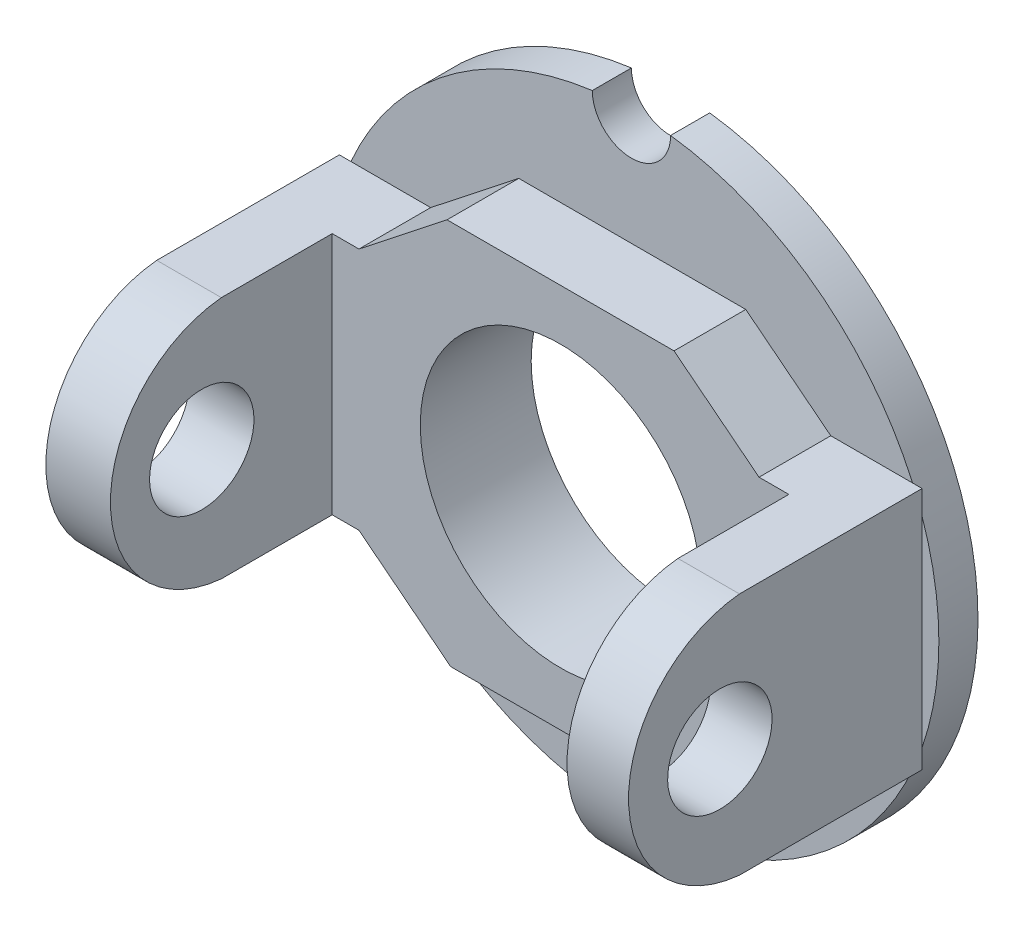
ISO-10303-21;
HEADER;
FILE_DESCRIPTION(('STEP AP214'),'2;1');
FILE_NAME('part.step','',(''),(''),'','','');
FILE_SCHEMA(('AUTOMOTIVE_DESIGN { 1 0 10303 214 1 1 1 1 }'));
ENDSEC;
DATA;
#1=APPLICATION_CONTEXT('core data for automotive mechanical design processes');
#2=APPLICATION_PROTOCOL_DEFINITION('international standard','automotive_design',2000,#1);
#3=PRODUCT_CONTEXT('',#1,'mechanical');
#4=PRODUCT('Part','Part','',(#3));
#5=PRODUCT_RELATED_PRODUCT_CATEGORY('part','',(#4));
#6=PRODUCT_DEFINITION_FORMATION('','',#4);
#7=PRODUCT_DEFINITION_CONTEXT('part definition',#1,'design');
#8=PRODUCT_DEFINITION('design','',#6,#7);
#9=PRODUCT_DEFINITION_SHAPE('','',#8);
#10=(LENGTH_UNIT() NAMED_UNIT(*) SI_UNIT(.MILLI.,.METRE.));
#11=(NAMED_UNIT(*) PLANE_ANGLE_UNIT() SI_UNIT($,.RADIAN.));
#12=(NAMED_UNIT(*) SI_UNIT($,.STERADIAN.) SOLID_ANGLE_UNIT());
#13=UNCERTAINTY_MEASURE_WITH_UNIT(LENGTH_MEASURE(1.E-05),#10,'distance_accuracy_value','');
#14=(GEOMETRIC_REPRESENTATION_CONTEXT(3) GLOBAL_UNCERTAINTY_ASSIGNED_CONTEXT((#13)) GLOBAL_UNIT_ASSIGNED_CONTEXT((#10,
#11,#12)) REPRESENTATION_CONTEXT('',''));
#15=CARTESIAN_POINT('',(0.,0.,0.));
#16=DIRECTION('',(0.,0.,1.));
#17=DIRECTION('',(1.,0.,0.));
#18=AXIS2_PLACEMENT_3D('',#15,#16,#17);
#19=CARTESIAN_POINT('',(22.2147106784625,0.,8.5));
#20=DIRECTION('',(1.,0.,0.));
#21=DIRECTION('',(0.,1.,0.));
#22=AXIS2_PLACEMENT_3D('',#19,#20,#21);
#23=PLANE('',#22);
#24=CARTESIAN_POINT('',(22.2147106784625,-0.0236961405543032,18.5031826355078));
#25=DIRECTION('',(1.,0.,0.));
#26=DIRECTION('',(0.,1.,0.));
#27=AXIS2_PLACEMENT_3D('',#24,#25,#26);
#28=CIRCLE('',#27,4.);
#29=CARTESIAN_POINT('',(22.2147106784625,3.9763038594457,18.5031826355078));
#30=VERTEX_POINT('',#29);
#31=EDGE_CURVE('E803',#30,#30,#28,.T.);
#32=ORIENTED_EDGE('',*,*,#31,.F.);
#33=EDGE_LOOP('',(#32));
#34=FACE_BOUND('',#33,.T.);
#35=CARTESIAN_POINT('',(22.2147106784625,0.187364912083141,16.1239867647059));
#36=DIRECTION('',(-1.,0.,0.));
#37=DIRECTION('',(0.,-1.,0.));
#38=AXIS2_PLACEMENT_3D('',#35,#36,#37);
#39=CIRCLE('',#38,9.37601323529412);
#40=CARTESIAN_POINT('',(22.2147106784625,-9.14763508791686,17.));
#41=VERTEX_POINT('',#40);
#42=CARTESIAN_POINT('',(22.2147106784625,9.52236491208314,17.));
#43=VERTEX_POINT('',#42);
#44=EDGE_CURVE('E186',#41,#43,#39,.T.);
#45=ORIENTED_EDGE('',*,*,#44,.F.);
#46=DIRECTION('',(0.,0.,-1.));
#47=VECTOR('',#46,1.);
#48=CARTESIAN_POINT('',(22.2147106784625,-9.14763508791686,8.5));
#49=LINE('',#48,#47);
#50=CARTESIAN_POINT('',(22.2147106784625,-9.14763508791686,3.));
#51=VERTEX_POINT('',#50);
#52=EDGE_CURVE('E208',#41,#51,#49,.T.);
#53=ORIENTED_EDGE('',*,*,#52,.T.);
#54=DIRECTION('',(0.,-1.,0.));
#55=VECTOR('',#54,1.);
#56=CARTESIAN_POINT('',(22.2147106784625,0.,3.));
#57=LINE('',#56,#55);
#58=CARTESIAN_POINT('',(22.2147106784625,-7.6652873052617,3.));
#59=VERTEX_POINT('',#58);
#60=EDGE_CURVE('E47',#59,#51,#57,.T.);
#61=ORIENTED_EDGE('',*,*,#60,.F.);
#62=CARTESIAN_POINT('',(22.2147106784625,7.66528730526171,3.));
#63=VERTEX_POINT('',#62);
#64=EDGE_CURVE('E11',#63,#59,#57,.T.);
#65=ORIENTED_EDGE('',*,*,#64,.F.);
#66=CARTESIAN_POINT('',(22.2147106784625,9.52236491208314,3.));
#67=VERTEX_POINT('',#66);
#68=EDGE_CURVE('E46',#67,#63,#57,.T.);
#69=ORIENTED_EDGE('',*,*,#68,.F.);
#70=DIRECTION('',(0.,0.,-1.));
#71=VECTOR('',#70,1.);
#72=CARTESIAN_POINT('',(22.2147106784625,9.52236491208314,8.5));
#73=LINE('',#72,#71);
#74=EDGE_CURVE('E200',#43,#67,#73,.T.);
#75=ORIENTED_EDGE('',*,*,#74,.F.);
#76=EDGE_LOOP('',(#45,#53,#61,#65,#69,#75));
#77=FACE_BOUND('',#76,.T.);
#78=ADVANCED_FACE('F35',(#34,#77),#23,.T.);
#79=CARTESIAN_POINT('',(17.5,9.52236491208314,25.5));
#80=DIRECTION('',(1.,0.,0.));
#81=DIRECTION('',(0.,1.,0.));
#82=AXIS2_PLACEMENT_3D('',#79,#80,#81);
#83=PLANE('',#82);
#84=CARTESIAN_POINT('',(17.5,-0.0236961405543041,18.5031826355078));
#85=DIRECTION('',(1.,0.,0.));
#86=DIRECTION('',(0.,1.,0.));
#87=AXIS2_PLACEMENT_3D('',#84,#85,#86);
#88=CIRCLE('',#87,4.);
#89=CARTESIAN_POINT('',(17.5,3.9763038594457,18.5031826355078));
#90=VERTEX_POINT('',#89);
#91=EDGE_CURVE('E39',#90,#90,#88,.T.);
#92=ORIENTED_EDGE('',*,*,#91,.T.);
#93=EDGE_LOOP('',(#92));
#94=FACE_BOUND('',#93,.T.);
#95=DIRECTION('',(0.,0.,-1.));
#96=VECTOR('',#95,1.);
#97=CARTESIAN_POINT('',(17.5,-9.14763508791686,25.5));
#98=LINE('',#97,#96);
#99=CARTESIAN_POINT('',(17.5,-9.14763508791686,17.));
#100=VERTEX_POINT('',#99);
#101=CARTESIAN_POINT('',(17.5,-9.14763508791686,8.5));
#102=VERTEX_POINT('',#101);
#103=EDGE_CURVE('E276',#100,#102,#98,.T.);
#104=ORIENTED_EDGE('',*,*,#103,.F.);
#105=CARTESIAN_POINT('',(17.5,0.18736491208314,16.1239867647059));
#106=DIRECTION('',(1.,0.,0.));
#107=DIRECTION('',(0.,1.,0.));
#108=AXIS2_PLACEMENT_3D('',#105,#106,#107);
#109=CIRCLE('',#108,9.37601323529412);
#110=CARTESIAN_POINT('',(17.5,9.52236491208314,17.));
#111=VERTEX_POINT('',#110);
#112=EDGE_CURVE('E54',#100,#111,#109,.F.);
#113=ORIENTED_EDGE('',*,*,#112,.T.);
#114=DIRECTION('',(0.,0.,-1.));
#115=VECTOR('',#114,1.);
#116=CARTESIAN_POINT('',(17.5,9.52236491208314,25.5));
#117=LINE('',#116,#115);
#118=CARTESIAN_POINT('',(17.5,9.52236491208314,8.5));
#119=VERTEX_POINT('',#118);
#120=EDGE_CURVE('E203',#111,#119,#117,.T.);
#121=ORIENTED_EDGE('',*,*,#120,.T.);
#122=DIRECTION('',(0.,-1.,0.));
#123=VECTOR('',#122,1.);
#124=CARTESIAN_POINT('',(17.5,9.52236491208314,8.5));
#125=LINE('',#124,#123);
#126=EDGE_CURVE('E273',#119,#102,#125,.T.);
#127=ORIENTED_EDGE('',*,*,#126,.T.);
#128=EDGE_LOOP('',(#104,#113,#121,#127));
#129=FACE_BOUND('',#128,.T.);
#130=ADVANCED_FACE('F424',(#94,#129),#83,.F.);
#131=CARTESIAN_POINT('',(-22.4527235202593,0.,8.5));
#132=DIRECTION('',(1.,0.,0.));
#133=DIRECTION('',(0.,0.,-1.));
#134=AXIS2_PLACEMENT_3D('',#131,#132,#133);
#135=PLANE('',#134);
#136=CARTESIAN_POINT('',(-22.4527235202593,0.00174040851145366,18.5000002163587));
#137=DIRECTION('',(-1.,0.,0.));
#138=DIRECTION('',(0.,0.,1.));
#139=AXIS2_PLACEMENT_3D('',#136,#137,#138);
#140=CIRCLE('',#139,4.);
#141=CARTESIAN_POINT('',(-22.4527235202593,0.00174040851145366,22.5000002163587));
#142=VERTEX_POINT('',#141);
#143=EDGE_CURVE('E257',#142,#142,#140,.T.);
#144=ORIENTED_EDGE('',*,*,#143,.F.);
#145=EDGE_LOOP('',(#144));
#146=FACE_BOUND('',#145,.T.);
#147=DIRECTION('',(0.,0.,-1.));
#148=VECTOR('',#147,1.);
#149=CARTESIAN_POINT('',(-22.4527235202593,-9.335,8.5));
#150=LINE('',#149,#148);
#151=CARTESIAN_POINT('',(-22.4527235202593,-9.335,17.));
#152=VERTEX_POINT('',#151);
#153=CARTESIAN_POINT('',(-22.4527235202593,-9.335,3.));
#154=VERTEX_POINT('',#153);
#155=EDGE_CURVE('E229',#152,#154,#150,.T.);
#156=ORIENTED_EDGE('',*,*,#155,.F.);
#157=CARTESIAN_POINT('',(-22.4527235202593,0.,16.1239867647059));
#158=DIRECTION('',(1.,0.,0.));
#159=DIRECTION('',(0.,0.,-1.));
#160=AXIS2_PLACEMENT_3D('',#157,#158,#159);
#161=CIRCLE('',#160,9.37601323529412);
#162=CARTESIAN_POINT('',(-22.4527235202593,9.335,17.));
#163=VERTEX_POINT('',#162);
#164=EDGE_CURVE('E256',#163,#152,#161,.T.);
#165=ORIENTED_EDGE('',*,*,#164,.F.);
#166=DIRECTION('',(0.,0.,-1.));
#167=VECTOR('',#166,1.);
#168=CARTESIAN_POINT('',(-22.4527235202593,9.335,8.5));
#169=LINE('',#168,#167);
#170=CARTESIAN_POINT('',(-22.4527235202593,9.335,3.));
#171=VERTEX_POINT('',#170);
#172=EDGE_CURVE('E231',#163,#171,#169,.T.);
#173=ORIENTED_EDGE('',*,*,#172,.T.);
#174=DIRECTION('',(0.,-1.,0.));
#175=VECTOR('',#174,1.);
#176=CARTESIAN_POINT('',(-22.4527235202593,0.,3.));
#177=LINE('',#176,#175);
#178=CARTESIAN_POINT('',(-22.4527235202593,6.93723334786977,3.));
#179=VERTEX_POINT('',#178);
#180=EDGE_CURVE('E324',#171,#179,#177,.T.);
#181=ORIENTED_EDGE('',*,*,#180,.T.);
#182=CARTESIAN_POINT('',(-22.4527235202593,-6.93723334786977,3.));
#183=VERTEX_POINT('',#182);
#184=EDGE_CURVE('E44',#179,#183,#177,.T.);
#185=ORIENTED_EDGE('',*,*,#184,.T.);
#186=EDGE_CURVE('E323',#183,#154,#177,.T.);
#187=ORIENTED_EDGE('',*,*,#186,.T.);
#188=EDGE_LOOP('',(#156,#165,#173,#181,#185,#187));
#189=FACE_BOUND('',#188,.T.);
#190=ADVANCED_FACE('F426',(#146,#189),#135,.F.);
#191=CARTESIAN_POINT('',(-17.5,9.335,25.5));
#192=DIRECTION('',(-1.,0.,0.));
#193=DIRECTION('',(0.,-1.,0.));
#194=AXIS2_PLACEMENT_3D('',#191,#192,#193);
#195=PLANE('',#194);
#196=CARTESIAN_POINT('',(-17.5,0.00174040851145366,18.5000002163587));
#197=DIRECTION('',(-1.,0.,0.));
#198=DIRECTION('',(0.,-1.,0.));
#199=AXIS2_PLACEMENT_3D('',#196,#197,#198);
#200=CIRCLE('',#199,4.);
#201=CARTESIAN_POINT('',(-17.5,-3.99825959148855,18.5000002163587));
#202=VERTEX_POINT('',#201);
#203=EDGE_CURVE('E254',#202,#202,#200,.T.);
#204=ORIENTED_EDGE('',*,*,#203,.T.);
#205=EDGE_LOOP('',(#204));
#206=FACE_BOUND('',#205,.T.);
#207=DIRECTION('',(0.,0.,-1.));
#208=VECTOR('',#207,1.);
#209=CARTESIAN_POINT('',(-17.5,9.335,25.5));
#210=LINE('',#209,#208);
#211=CARTESIAN_POINT('',(-17.5,9.335,17.));
#212=VERTEX_POINT('',#211);
#213=CARTESIAN_POINT('',(-17.5,9.335,8.5));
#214=VERTEX_POINT('',#213);
#215=EDGE_CURVE('E282',#212,#214,#210,.T.);
#216=ORIENTED_EDGE('',*,*,#215,.F.);
#217=CARTESIAN_POINT('',(-17.5,0.,16.1239867647059));
#218=DIRECTION('',(-1.,0.,0.));
#219=DIRECTION('',(0.,-1.,0.));
#220=AXIS2_PLACEMENT_3D('',#217,#218,#219);
#221=CIRCLE('',#220,9.37601323529412);
#222=CARTESIAN_POINT('',(-17.5,-9.335,17.));
#223=VERTEX_POINT('',#222);
#224=EDGE_CURVE('E62',#212,#223,#221,.F.);
#225=ORIENTED_EDGE('',*,*,#224,.T.);
#226=DIRECTION('',(0.,0.,-1.));
#227=VECTOR('',#226,1.);
#228=CARTESIAN_POINT('',(-17.5,-9.335,25.5));
#229=LINE('',#228,#227);
#230=CARTESIAN_POINT('',(-17.5,-9.335,8.5));
#231=VERTEX_POINT('',#230);
#232=EDGE_CURVE('E284',#223,#231,#229,.T.);
#233=ORIENTED_EDGE('',*,*,#232,.T.);
#234=DIRECTION('',(0.,1.,0.));
#235=VECTOR('',#234,1.);
#236=CARTESIAN_POINT('',(-17.5,9.335,8.5));
#237=LINE('',#236,#235);
#238=EDGE_CURVE('E279',#231,#214,#237,.T.);
#239=ORIENTED_EDGE('',*,*,#238,.T.);
#240=EDGE_LOOP('',(#216,#225,#233,#239));
#241=FACE_BOUND('',#240,.T.);
#242=ADVANCED_FACE('F403',(#206,#241),#195,.F.);
#243=CARTESIAN_POINT('',(0.,0.,8.5));
#244=DIRECTION('',(0.,0.,1.));
#245=DIRECTION('',(1.,0.,0.));
#246=AXIS2_PLACEMENT_3D('',#243,#244,#245);
#247=PLANE('',#246);
#248=CARTESIAN_POINT('',(0.,0.,8.5));
#249=DIRECTION('',(0.,0.,1.));
#250=DIRECTION('',(1.,0.,0.));
#251=AXIS2_PLACEMENT_3D('',#248,#249,#250);
#252=CIRCLE('',#251,10.75);
#253=CARTESIAN_POINT('',(10.75,0.,8.5));
#254=VERTEX_POINT('',#253);
#255=EDGE_CURVE('E316',#254,#254,#252,.F.);
#256=ORIENTED_EDGE('',*,*,#255,.T.);
#257=EDGE_LOOP('',(#256));
#258=FACE_BOUND('',#257,.T.);
#259=DIRECTION('',(1.,0.,0.));
#260=VECTOR('',#259,1.);
#261=CARTESIAN_POINT('',(0.,-9.14763508791686,8.5));
#262=LINE('',#261,#260);
#263=CARTESIAN_POINT('',(15.2147106784625,-9.14763508791686,8.5));
#264=VERTEX_POINT('',#263);
#265=EDGE_CURVE('E302',#264,#102,#262,.T.);
#266=ORIENTED_EDGE('',*,*,#265,.T.);
#267=ORIENTED_EDGE('',*,*,#126,.F.);
#268=DIRECTION('',(1.,0.,0.));
#269=VECTOR('',#268,1.);
#270=CARTESIAN_POINT('',(0.,9.52236491208314,8.5));
#271=LINE('',#270,#269);
#272=CARTESIAN_POINT('',(15.2147106784625,9.52236491208314,8.5));
#273=VERTEX_POINT('',#272);
#274=EDGE_CURVE('E305',#273,#119,#271,.T.);
#275=ORIENTED_EDGE('',*,*,#274,.F.);
#276=DIRECTION('',(0.785748948580454,-0.618545543840314,0.));
#277=VECTOR('',#276,1.);
#278=CARTESIAN_POINT('',(10.4492010300799,13.2737981942535,8.5));
#279=LINE('',#278,#277);
#280=CARTESIAN_POINT('',(8.7,14.650778086357,8.5));
#281=VERTEX_POINT('',#280);
#282=EDGE_CURVE('E307',#281,#273,#279,.T.);
#283=ORIENTED_EDGE('',*,*,#282,.F.);
#284=DIRECTION('',(1.,0.,0.));
#285=VECTOR('',#284,1.);
#286=CARTESIAN_POINT('',(0.,14.650778086357,8.5));
#287=LINE('',#286,#285);
#288=CARTESIAN_POINT('',(-8.7,14.650778086357,8.5));
#289=VERTEX_POINT('',#288);
#290=EDGE_CURVE('E310',#289,#281,#287,.T.);
#291=ORIENTED_EDGE('',*,*,#290,.F.);
#292=DIRECTION('',(0.785748948580454,0.618545543840315,0.));
#293=VECTOR('',#292,1.);
#294=CARTESIAN_POINT('',(-10.4492010300799,13.2737981942534,8.5));
#295=LINE('',#294,#293);
#296=CARTESIAN_POINT('',(-15.4527235202593,9.335,8.5));
#297=VERTEX_POINT('',#296);
#298=EDGE_CURVE('E313',#297,#289,#295,.T.);
#299=ORIENTED_EDGE('',*,*,#298,.F.);
#300=DIRECTION('',(-1.,0.,0.));
#301=VECTOR('',#300,1.);
#302=CARTESIAN_POINT('',(0.,9.335,8.5));
#303=LINE('',#302,#301);
#304=EDGE_CURVE('E287',#297,#214,#303,.T.);
#305=ORIENTED_EDGE('',*,*,#304,.T.);
#306=ORIENTED_EDGE('',*,*,#238,.F.);
#307=DIRECTION('',(-1.,0.,0.));
#308=VECTOR('',#307,1.);
#309=CARTESIAN_POINT('',(0.,-9.335,8.5));
#310=LINE('',#309,#308);
#311=CARTESIAN_POINT('',(-15.4527235202593,-9.335,8.5));
#312=VERTEX_POINT('',#311);
#313=EDGE_CURVE('E290',#312,#231,#310,.T.);
#314=ORIENTED_EDGE('',*,*,#313,.F.);
#315=DIRECTION('',(-0.785748948580459,0.618545543840309,0.));
#316=VECTOR('',#315,1.);
#317=CARTESIAN_POINT('',(-10.4492010300798,-13.2737981942535,8.5));
#318=LINE('',#317,#316);
#319=CARTESIAN_POINT('',(-8.422507082424,-14.869221913643,8.5));
#320=VERTEX_POINT('',#319);
#321=EDGE_CURVE('E294',#320,#312,#318,.T.);
#322=ORIENTED_EDGE('',*,*,#321,.F.);
#323=DIRECTION('',(1.,0.,0.));
#324=VECTOR('',#323,1.);
#325=CARTESIAN_POINT('',(0.,-14.869221913643,8.5));
#326=LINE('',#325,#324);
#327=CARTESIAN_POINT('',(7.94648139883036,-14.869221913643,8.5));
#328=VERTEX_POINT('',#327);
#329=EDGE_CURVE('E297',#320,#328,#326,.T.);
#330=ORIENTED_EDGE('',*,*,#329,.T.);
#331=DIRECTION('',(-0.785748948580459,-0.618545543840309,0.));
#332=VECTOR('',#331,1.);
#333=CARTESIAN_POINT('',(10.267074274826,-13.042439472371,8.5));
#334=LINE('',#333,#332);
#335=EDGE_CURVE('E299',#264,#328,#334,.T.);
#336=ORIENTED_EDGE('',*,*,#335,.F.);
#337=EDGE_LOOP('',(#266,#267,#275,#283,#291,#299,#305,#306,#314,#322,#330,#336));
#338=FACE_BOUND('',#337,.T.);
#339=ADVANCED_FACE('F371',(#258,#338),#247,.T.);
#340=CARTESIAN_POINT('',(-0.0332731557539049,11.6538137343801,3.));
#341=DIRECTION('',(0.,0.,1.));
#342=DIRECTION('',(1.,0.,0.));
#343=AXIS2_PLACEMENT_3D('',#340,#341,#342);
#344=PLANE('',#343);
#345=CARTESIAN_POINT('',(0.,0.,3.));
#346=DIRECTION('',(0.,0.,1.));
#347=DIRECTION('',(-1.,0.,0.));
#348=AXIS2_PLACEMENT_3D('',#345,#346,#347);
#349=CIRCLE('',#348,23.5);
#350=EDGE_CURVE('E381',#59,#63,#349,.T.);
#351=ORIENTED_EDGE('',*,*,#350,.T.);
#352=ORIENTED_EDGE('',*,*,#64,.T.);
#353=EDGE_LOOP('',(#351,#352));
#354=FACE_BOUND('',#353,.T.);
#355=ADVANCED_FACE('F446',(#354),#344,.T.);
#356=DIRECTION('',(-1.,0.,0.));
#357=VECTOR('',#356,1.);
#358=CARTESIAN_POINT('',(0.,9.335,3.));
#359=LINE('',#358,#357);
#360=CARTESIAN_POINT('',(-15.4527235202593,9.335,3.));
#361=VERTEX_POINT('',#360);
#362=CARTESIAN_POINT('',(-21.5663574810398,9.335,3.));
#363=VERTEX_POINT('',#362);
#364=EDGE_CURVE('E320',#361,#363,#359,.T.);
#365=ORIENTED_EDGE('',*,*,#364,.F.);
#366=DIRECTION('',(0.785748948580454,0.618545543840315,0.));
#367=VECTOR('',#366,1.);
#368=CARTESIAN_POINT('',(-10.4492010300799,13.2737981942534,3.));
#369=LINE('',#368,#367);
#370=CARTESIAN_POINT('',(-8.7,14.650778086357,3.));
#371=VERTEX_POINT('',#370);
#372=EDGE_CURVE('E291',#361,#371,#369,.T.);
#373=ORIENTED_EDGE('',*,*,#372,.T.);
#374=DIRECTION('',(1.,0.,0.));
#375=VECTOR('',#374,1.);
#376=CARTESIAN_POINT('',(0.,14.650778086357,3.));
#377=LINE('',#376,#375);
#378=CARTESIAN_POINT('',(8.7,14.650778086357,3.));
#379=VERTEX_POINT('',#378);
#380=EDGE_CURVE('E346',#371,#379,#377,.T.);
#381=ORIENTED_EDGE('',*,*,#380,.T.);
#382=DIRECTION('',(0.785748948580454,-0.618545543840314,0.));
#383=VECTOR('',#382,1.);
#384=CARTESIAN_POINT('',(10.4492010300799,13.2737981942535,3.));
#385=LINE('',#384,#383);
#386=CARTESIAN_POINT('',(15.2147106784625,9.52236491208314,3.));
#387=VERTEX_POINT('',#386);
#388=EDGE_CURVE('E344',#379,#387,#385,.T.);
#389=ORIENTED_EDGE('',*,*,#388,.T.);
#390=DIRECTION('',(1.,0.,0.));
#391=VECTOR('',#390,1.);
#392=CARTESIAN_POINT('',(0.,9.52236491208314,3.));
#393=LINE('',#392,#391);
#394=CARTESIAN_POINT('',(21.4842865015603,9.52236491208314,3.));
#395=VERTEX_POINT('',#394);
#396=EDGE_CURVE('E342',#387,#395,#393,.T.);
#397=ORIENTED_EDGE('',*,*,#396,.T.);
#398=CARTESIAN_POINT('',(2.93345368849219,23.3161928594158,3.));
#399=VERTEX_POINT('',#398);
#400=EDGE_CURVE('E240',#395,#399,#349,.T.);
#401=ORIENTED_EDGE('',*,*,#400,.T.);
#402=CARTESIAN_POINT('',(-0.0665463115078098,23.3076274687603,3.));
#403=DIRECTION('',(0.,0.,-1.));
#404=DIRECTION('',(1.,0.,0.));
#405=AXIS2_PLACEMENT_3D('',#402,#403,#404);
#406=CIRCLE('',#405,3.00001222762793);
#407=CARTESIAN_POINT('',(-3.06654631150781,23.2990620781047,3.));
#408=VERTEX_POINT('',#407);
#409=EDGE_CURVE('E237',#399,#408,#406,.T.);
#410=ORIENTED_EDGE('',*,*,#409,.T.);
#411=EDGE_CURVE('E242',#408,#363,#349,.T.);
#412=ORIENTED_EDGE('',*,*,#411,.T.);
#413=EDGE_LOOP('',(#365,#373,#381,#389,#397,#401,#410,#412));
#414=FACE_BOUND('',#413,.T.);
#415=ADVANCED_FACE('F364',(#414),#344,.T.);
#416=DIRECTION('',(1.,0.,0.));
#417=VECTOR('',#416,1.);
#418=CARTESIAN_POINT('',(0.,-9.14763508791686,3.));
#419=LINE('',#418,#417);
#420=CARTESIAN_POINT('',(15.2147106784625,-9.14763508791686,3.));
#421=VERTEX_POINT('',#420);
#422=CARTESIAN_POINT('',(21.6464956124152,-9.14763508791686,3.));
#423=VERTEX_POINT('',#422);
#424=EDGE_CURVE('E338',#421,#423,#419,.T.);
#425=ORIENTED_EDGE('',*,*,#424,.F.);
#426=DIRECTION('',(-0.785748948580459,-0.618545543840309,0.));
#427=VECTOR('',#426,1.);
#428=CARTESIAN_POINT('',(10.267074274826,-13.042439472371,3.));
#429=LINE('',#428,#427);
#430=CARTESIAN_POINT('',(7.94648139883036,-14.869221913643,3.));
#431=VERTEX_POINT('',#430);
#432=EDGE_CURVE('E335',#421,#431,#429,.T.);
#433=ORIENTED_EDGE('',*,*,#432,.T.);
#434=DIRECTION('',(1.,0.,0.));
#435=VECTOR('',#434,1.);
#436=CARTESIAN_POINT('',(0.,-14.869221913643,3.));
#437=LINE('',#436,#435);
#438=CARTESIAN_POINT('',(-8.422507082424,-14.869221913643,3.));
#439=VERTEX_POINT('',#438);
#440=EDGE_CURVE('E332',#439,#431,#437,.T.);
#441=ORIENTED_EDGE('',*,*,#440,.F.);
#442=DIRECTION('',(-0.785748948580459,0.618545543840309,0.));
#443=VECTOR('',#442,1.);
#444=CARTESIAN_POINT('',(-10.4492010300798,-13.2737981942535,3.));
#445=LINE('',#444,#443);
#446=CARTESIAN_POINT('',(-15.4527235202593,-9.335,3.));
#447=VERTEX_POINT('',#446);
#448=EDGE_CURVE('E330',#439,#447,#445,.T.);
#449=ORIENTED_EDGE('',*,*,#448,.T.);
#450=DIRECTION('',(-1.,0.,0.));
#451=VECTOR('',#450,1.);
#452=CARTESIAN_POINT('',(0.,-9.335,3.));
#453=LINE('',#452,#451);
#454=CARTESIAN_POINT('',(-21.5663574810398,-9.335,3.));
#455=VERTEX_POINT('',#454);
#456=EDGE_CURVE('E328',#447,#455,#453,.T.);
#457=ORIENTED_EDGE('',*,*,#456,.T.);
#458=EDGE_CURVE('E823',#455,#423,#349,.T.);
#459=ORIENTED_EDGE('',*,*,#458,.T.);
#460=EDGE_LOOP('',(#425,#433,#441,#449,#457,#459));
#461=FACE_BOUND('',#460,.T.);
#462=ADVANCED_FACE('F479',(#461),#344,.T.);
#463=ORIENTED_EDGE('',*,*,#184,.F.);
#464=EDGE_CURVE('E821',#179,#183,#349,.T.);
#465=ORIENTED_EDGE('',*,*,#464,.T.);
#466=EDGE_LOOP('',(#463,#465));
#467=FACE_BOUND('',#466,.T.);
#468=ADVANCED_FACE('F475',(#467),#344,.T.);
#469=CARTESIAN_POINT('',(-0.0332731557539049,11.6538137343801,0.));
#470=DIRECTION('',(0.,0.,1.));
#471=DIRECTION('',(1.,0.,0.));
#472=AXIS2_PLACEMENT_3D('',#469,#470,#471);
#473=PLANE('',#472);
#474=CARTESIAN_POINT('',(-0.0665463115078098,23.3076274687603,0.));
#475=DIRECTION('',(0.,0.,-1.));
#476=DIRECTION('',(1.,0.,0.));
#477=AXIS2_PLACEMENT_3D('',#474,#475,#476);
#478=CIRCLE('',#477,3.00001222762793);
#479=CARTESIAN_POINT('',(2.93345368849219,23.3161928594158,0.));
#480=VERTEX_POINT('',#479);
#481=CARTESIAN_POINT('',(-3.06654631150781,23.2990620781047,0.));
#482=VERTEX_POINT('',#481);
#483=EDGE_CURVE('E236',#480,#482,#478,.T.);
#484=ORIENTED_EDGE('',*,*,#483,.F.);
#485=CARTESIAN_POINT('',(0.,0.,0.));
#486=DIRECTION('',(0.,0.,1.));
#487=DIRECTION('',(-1.,0.,0.));
#488=AXIS2_PLACEMENT_3D('',#485,#486,#487);
#489=CIRCLE('',#488,23.5);
#490=EDGE_CURVE('E241',#482,#480,#489,.T.);
#491=ORIENTED_EDGE('',*,*,#490,.F.);
#492=EDGE_LOOP('',(#484,#491));
#493=FACE_BOUND('',#492,.T.);
#494=CARTESIAN_POINT('',(0.,0.,0.));
#495=DIRECTION('',(0.,0.,1.));
#496=DIRECTION('',(1.,0.,0.));
#497=AXIS2_PLACEMENT_3D('',#494,#495,#496);
#498=CIRCLE('',#497,10.75);
#499=CARTESIAN_POINT('',(10.75,0.,0.));
#500=VERTEX_POINT('',#499);
#501=EDGE_CURVE('E233',#500,#500,#498,.T.);
#502=ORIENTED_EDGE('',*,*,#501,.T.);
#503=EDGE_LOOP('',(#502));
#504=FACE_BOUND('',#503,.T.);
#505=ADVANCED_FACE('F478',(#493,#504),#473,.F.);
#506=CARTESIAN_POINT('',(-0.0665463115078098,23.3076274687603,3.));
#507=DIRECTION('',(0.,0.,-1.));
#508=DIRECTION('',(-1.,0.,0.));
#509=AXIS2_PLACEMENT_3D('',#506,#507,#508);
#510=CYLINDRICAL_SURFACE('',#509,3.00001222762793);
#511=ORIENTED_EDGE('',*,*,#483,.T.);
#512=DIRECTION('',(0.,0.,-1.));
#513=VECTOR('',#512,1.);
#514=CARTESIAN_POINT('',(-3.06654631150781,23.2990620781047,3.));
#515=LINE('',#514,#513);
#516=EDGE_CURVE('E252',#408,#482,#515,.T.);
#517=ORIENTED_EDGE('',*,*,#516,.F.);
#518=ORIENTED_EDGE('',*,*,#409,.F.);
#519=DIRECTION('',(0.,0.,-1.));
#520=VECTOR('',#519,1.);
#521=CARTESIAN_POINT('',(2.93345368849219,23.3161928594158,3.));
#522=LINE('',#521,#520);
#523=EDGE_CURVE('E245',#399,#480,#522,.T.);
#524=ORIENTED_EDGE('',*,*,#523,.T.);
#525=EDGE_LOOP('',(#511,#517,#518,#524));
#526=FACE_BOUND('',#525,.T.);
#527=ADVANCED_FACE('F37',(#526),#510,.F.);
#528=CARTESIAN_POINT('',(0.,0.,3.));
#529=DIRECTION('',(0.,0.,-1.));
#530=DIRECTION('',(-1.,0.,0.));
#531=AXIS2_PLACEMENT_3D('',#528,#529,#530);
#532=CYLINDRICAL_SURFACE('',#531,23.5);
#533=ORIENTED_EDGE('',*,*,#490,.T.);
#534=ORIENTED_EDGE('',*,*,#523,.F.);
#535=ORIENTED_EDGE('',*,*,#400,.F.);
#536=EDGE_CURVE('E377',#63,#395,#349,.T.);
#537=ORIENTED_EDGE('',*,*,#536,.F.);
#538=ORIENTED_EDGE('',*,*,#350,.F.);
#539=EDGE_CURVE('E382',#423,#59,#349,.T.);
#540=ORIENTED_EDGE('',*,*,#539,.F.);
#541=ORIENTED_EDGE('',*,*,#458,.F.);
#542=EDGE_CURVE('E818',#183,#455,#349,.T.);
#543=ORIENTED_EDGE('',*,*,#542,.F.);
#544=ORIENTED_EDGE('',*,*,#464,.F.);
#545=EDGE_CURVE('E246',#363,#179,#349,.T.);
#546=ORIENTED_EDGE('',*,*,#545,.F.);
#547=ORIENTED_EDGE('',*,*,#411,.F.);
#548=ORIENTED_EDGE('',*,*,#516,.T.);
#549=EDGE_LOOP('',(#533,#534,#535,#537,#538,#540,#541,#543,#544,#546,#547,#548));
#550=FACE_BOUND('',#549,.T.);
#551=ADVANCED_FACE('F386',(#550),#532,.T.);
#552=CARTESIAN_POINT('',(0.,0.,3.));
#553=DIRECTION('',(0.,0.,-1.));
#554=DIRECTION('',(-1.,0.,0.));
#555=AXIS2_PLACEMENT_3D('',#552,#553,#554);
#556=CYLINDRICAL_SURFACE('',#555,10.75);
#557=ORIENTED_EDGE('',*,*,#501,.F.);
#558=EDGE_LOOP('',(#557));
#559=FACE_BOUND('',#558,.T.);
#560=ORIENTED_EDGE('',*,*,#255,.F.);
#561=EDGE_LOOP('',(#560));
#562=FACE_BOUND('',#561,.T.);
#563=ADVANCED_FACE('F451',(#559,#562),#556,.F.);
#564=CARTESIAN_POINT('',(0.,0.,3.));
#565=DIRECTION('',(0.,0.,1.));
#566=DIRECTION('',(1.,0.,0.));
#567=AXIS2_PLACEMENT_3D('',#564,#565,#566);
#568=PLANE('',#567);
#569=EDGE_CURVE('E286',#363,#171,#359,.T.);
#570=ORIENTED_EDGE('',*,*,#569,.F.);
#571=ORIENTED_EDGE('',*,*,#545,.T.);
#572=ORIENTED_EDGE('',*,*,#180,.F.);
#573=EDGE_LOOP('',(#570,#571,#572));
#574=FACE_BOUND('',#573,.T.);
#575=ADVANCED_FACE('F395',(#574),#568,.F.);
#576=ORIENTED_EDGE('',*,*,#186,.F.);
#577=ORIENTED_EDGE('',*,*,#542,.T.);
#578=EDGE_CURVE('E327',#455,#154,#453,.T.);
#579=ORIENTED_EDGE('',*,*,#578,.T.);
#580=EDGE_LOOP('',(#576,#577,#579));
#581=FACE_BOUND('',#580,.T.);
#582=ADVANCED_FACE('F450',(#581),#568,.F.);
#583=EDGE_CURVE('E337',#423,#51,#419,.T.);
#584=ORIENTED_EDGE('',*,*,#583,.F.);
#585=ORIENTED_EDGE('',*,*,#539,.T.);
#586=ORIENTED_EDGE('',*,*,#60,.T.);
#587=EDGE_LOOP('',(#584,#585,#586));
#588=FACE_BOUND('',#587,.T.);
#589=ADVANCED_FACE('F563',(#588),#568,.F.);
#590=ORIENTED_EDGE('',*,*,#68,.T.);
#591=ORIENTED_EDGE('',*,*,#536,.T.);
#592=EDGE_CURVE('E341',#395,#67,#393,.T.);
#593=ORIENTED_EDGE('',*,*,#592,.T.);
#594=EDGE_LOOP('',(#590,#591,#593));
#595=FACE_BOUND('',#594,.T.);
#596=ADVANCED_FACE('F376',(#595),#568,.F.);
#597=CARTESIAN_POINT('',(0.,9.335,8.5));
#598=DIRECTION('',(0.,-1.,0.));
#599=DIRECTION('',(1.,0.,0.));
#600=AXIS2_PLACEMENT_3D('',#597,#598,#599);
#601=PLANE('',#600);
#602=ORIENTED_EDGE('',*,*,#172,.F.);
#603=DIRECTION('',(-1.,0.,0.));
#604=VECTOR('',#603,1.);
#605=CARTESIAN_POINT('',(-5.45272352025927,9.335,17.));
#606=LINE('',#605,#604);
#607=EDGE_CURVE('E268',#212,#163,#606,.T.);
#608=ORIENTED_EDGE('',*,*,#607,.F.);
#609=ORIENTED_EDGE('',*,*,#215,.T.);
#610=ORIENTED_EDGE('',*,*,#304,.F.);
#611=DIRECTION('',(0.,0.,-1.));
#612=VECTOR('',#611,1.);
#613=CARTESIAN_POINT('',(-15.4527235202593,9.335,8.5));
#614=LINE('',#613,#612);
#615=EDGE_CURVE('E319',#297,#361,#614,.T.);
#616=ORIENTED_EDGE('',*,*,#615,.T.);
#617=ORIENTED_EDGE('',*,*,#364,.T.);
#618=ORIENTED_EDGE('',*,*,#569,.T.);
#619=EDGE_LOOP('',(#602,#608,#609,#610,#616,#617,#618));
#620=FACE_BOUND('',#619,.T.);
#621=ADVANCED_FACE('F398',(#620),#601,.F.);
#622=CARTESIAN_POINT('',(0.,-9.335,8.5));
#623=DIRECTION('',(0.,-1.,0.));
#624=DIRECTION('',(1.,0.,0.));
#625=AXIS2_PLACEMENT_3D('',#622,#623,#624);
#626=PLANE('',#625);
#627=DIRECTION('',(-1.,0.,0.));
#628=VECTOR('',#627,1.);
#629=CARTESIAN_POINT('',(-5.45272352025927,-9.335,17.));
#630=LINE('',#629,#628);
#631=EDGE_CURVE('E260',#223,#152,#630,.T.);
#632=ORIENTED_EDGE('',*,*,#631,.T.);
#633=ORIENTED_EDGE('',*,*,#155,.T.);
#634=ORIENTED_EDGE('',*,*,#578,.F.);
#635=ORIENTED_EDGE('',*,*,#456,.F.);
#636=DIRECTION('',(0.,0.,-1.));
#637=VECTOR('',#636,1.);
#638=CARTESIAN_POINT('',(-15.4527235202593,-9.335,8.5));
#639=LINE('',#638,#637);
#640=EDGE_CURVE('E226',#312,#447,#639,.T.);
#641=ORIENTED_EDGE('',*,*,#640,.F.);
#642=ORIENTED_EDGE('',*,*,#313,.T.);
#643=ORIENTED_EDGE('',*,*,#232,.F.);
#644=EDGE_LOOP('',(#632,#633,#634,#635,#641,#642,#643));
#645=FACE_BOUND('',#644,.T.);
#646=ADVANCED_FACE('F406',(#645),#626,.T.);
#647=CARTESIAN_POINT('',(-10.4492010300798,-13.2737981942535,8.5));
#648=DIRECTION('',(-0.618545543840309,-0.785748948580459,0.));
#649=DIRECTION('',(0.785748948580459,-0.618545543840309,0.));
#650=AXIS2_PLACEMENT_3D('',#647,#648,#649);
#651=PLANE('',#650);
#652=ORIENTED_EDGE('',*,*,#448,.F.);
#653=DIRECTION('',(0.,0.,-1.));
#654=VECTOR('',#653,1.);
#655=CARTESIAN_POINT('',(-8.422507082424,-14.869221913643,8.5));
#656=LINE('',#655,#654);
#657=EDGE_CURVE('E223',#320,#439,#656,.T.);
#658=ORIENTED_EDGE('',*,*,#657,.F.);
#659=ORIENTED_EDGE('',*,*,#321,.T.);
#660=ORIENTED_EDGE('',*,*,#640,.T.);
#661=EDGE_LOOP('',(#652,#658,#659,#660));
#662=FACE_BOUND('',#661,.T.);
#663=ADVANCED_FACE('F412',(#662),#651,.T.);
#664=CARTESIAN_POINT('',(0.,-14.869221913643,8.5));
#665=DIRECTION('',(0.,1.,0.));
#666=DIRECTION('',(0.,0.,1.));
#667=AXIS2_PLACEMENT_3D('',#664,#665,#666);
#668=PLANE('',#667);
#669=ORIENTED_EDGE('',*,*,#440,.T.);
#670=DIRECTION('',(0.,0.,-1.));
#671=VECTOR('',#670,1.);
#672=CARTESIAN_POINT('',(7.94648139883036,-14.869221913643,8.5));
#673=LINE('',#672,#671);
#674=EDGE_CURVE('E220',#328,#431,#673,.T.);
#675=ORIENTED_EDGE('',*,*,#674,.F.);
#676=ORIENTED_EDGE('',*,*,#329,.F.);
#677=ORIENTED_EDGE('',*,*,#657,.T.);
#678=EDGE_LOOP('',(#669,#675,#676,#677));
#679=FACE_BOUND('',#678,.T.);
#680=ADVANCED_FACE('F416',(#679),#668,.F.);
#681=CARTESIAN_POINT('',(10.267074274826,-13.042439472371,8.5));
#682=DIRECTION('',(0.618545543840309,-0.785748948580459,0.));
#683=DIRECTION('',(0.785748948580459,0.618545543840309,0.));
#684=AXIS2_PLACEMENT_3D('',#681,#682,#683);
#685=PLANE('',#684);
#686=ORIENTED_EDGE('',*,*,#432,.F.);
#687=DIRECTION('',(0.,0.,-1.));
#688=VECTOR('',#687,1.);
#689=CARTESIAN_POINT('',(15.2147106784625,-9.14763508791686,8.5));
#690=LINE('',#689,#688);
#691=EDGE_CURVE('E211',#264,#421,#690,.T.);
#692=ORIENTED_EDGE('',*,*,#691,.F.);
#693=ORIENTED_EDGE('',*,*,#335,.T.);
#694=ORIENTED_EDGE('',*,*,#674,.T.);
#695=EDGE_LOOP('',(#686,#692,#693,#694));
#696=FACE_BOUND('',#695,.T.);
#697=ADVANCED_FACE('F421',(#696),#685,.T.);
#698=CARTESIAN_POINT('',(0.,-9.14763508791686,8.5));
#699=DIRECTION('',(0.,1.,0.));
#700=DIRECTION('',(-1.,0.,0.));
#701=AXIS2_PLACEMENT_3D('',#698,#699,#700);
#702=PLANE('',#701);
#703=ORIENTED_EDGE('',*,*,#52,.F.);
#704=DIRECTION('',(1.,0.,0.));
#705=VECTOR('',#704,1.);
#706=CARTESIAN_POINT('',(5.21471067846245,-9.14763508791686,17.));
#707=LINE('',#706,#705);
#708=EDGE_CURVE('E192',#100,#41,#707,.T.);
#709=ORIENTED_EDGE('',*,*,#708,.F.);
#710=ORIENTED_EDGE('',*,*,#103,.T.);
#711=ORIENTED_EDGE('',*,*,#265,.F.);
#712=ORIENTED_EDGE('',*,*,#691,.T.);
#713=ORIENTED_EDGE('',*,*,#424,.T.);
#714=ORIENTED_EDGE('',*,*,#583,.T.);
#715=EDGE_LOOP('',(#703,#709,#710,#711,#712,#713,#714));
#716=FACE_BOUND('',#715,.T.);
#717=ADVANCED_FACE('F423',(#716),#702,.F.);
#718=CARTESIAN_POINT('',(0.,9.52236491208314,8.5));
#719=DIRECTION('',(0.,1.,0.));
#720=DIRECTION('',(0.,0.,1.));
#721=AXIS2_PLACEMENT_3D('',#718,#719,#720);
#722=PLANE('',#721);
#723=DIRECTION('',(1.,0.,0.));
#724=VECTOR('',#723,1.);
#725=CARTESIAN_POINT('',(5.21471067846245,9.52236491208314,17.));
#726=LINE('',#725,#724);
#727=EDGE_CURVE('E189',#111,#43,#726,.T.);
#728=ORIENTED_EDGE('',*,*,#727,.T.);
#729=ORIENTED_EDGE('',*,*,#74,.T.);
#730=ORIENTED_EDGE('',*,*,#592,.F.);
#731=ORIENTED_EDGE('',*,*,#396,.F.);
#732=DIRECTION('',(0.,0.,-1.));
#733=VECTOR('',#732,1.);
#734=CARTESIAN_POINT('',(15.2147106784625,9.52236491208314,8.5));
#735=LINE('',#734,#733);
#736=EDGE_CURVE('E209',#273,#387,#735,.T.);
#737=ORIENTED_EDGE('',*,*,#736,.F.);
#738=ORIENTED_EDGE('',*,*,#274,.T.);
#739=ORIENTED_EDGE('',*,*,#120,.F.);
#740=EDGE_LOOP('',(#728,#729,#730,#731,#737,#738,#739));
#741=FACE_BOUND('',#740,.T.);
#742=ADVANCED_FACE('F198',(#741),#722,.T.);
#743=CARTESIAN_POINT('',(10.4492010300799,13.2737981942535,8.5));
#744=DIRECTION('',(0.618545543840314,0.785748948580455,0.));
#745=DIRECTION('',(-0.785748948580455,0.618545543840314,0.));
#746=AXIS2_PLACEMENT_3D('',#743,#744,#745);
#747=PLANE('',#746);
#748=ORIENTED_EDGE('',*,*,#388,.F.);
#749=DIRECTION('',(0.,0.,-1.));
#750=VECTOR('',#749,1.);
#751=CARTESIAN_POINT('',(8.7,14.650778086357,8.5));
#752=LINE('',#751,#750);
#753=EDGE_CURVE('E214',#281,#379,#752,.T.);
#754=ORIENTED_EDGE('',*,*,#753,.F.);
#755=ORIENTED_EDGE('',*,*,#282,.T.);
#756=ORIENTED_EDGE('',*,*,#736,.T.);
#757=EDGE_LOOP('',(#748,#754,#755,#756));
#758=FACE_BOUND('',#757,.T.);
#759=ADVANCED_FACE('F361',(#758),#747,.T.);
#760=CARTESIAN_POINT('',(0.,14.650778086357,8.5));
#761=DIRECTION('',(0.,1.,0.));
#762=DIRECTION('',(0.,0.,1.));
#763=AXIS2_PLACEMENT_3D('',#760,#761,#762);
#764=PLANE('',#763);
#765=ORIENTED_EDGE('',*,*,#380,.F.);
#766=DIRECTION('',(0.,0.,-1.));
#767=VECTOR('',#766,1.);
#768=CARTESIAN_POINT('',(-8.7,14.650778086357,8.5));
#769=LINE('',#768,#767);
#770=EDGE_CURVE('E351',#289,#371,#769,.T.);
#771=ORIENTED_EDGE('',*,*,#770,.F.);
#772=ORIENTED_EDGE('',*,*,#290,.T.);
#773=ORIENTED_EDGE('',*,*,#753,.T.);
#774=EDGE_LOOP('',(#765,#771,#772,#773));
#775=FACE_BOUND('',#774,.T.);
#776=ADVANCED_FACE('F357',(#775),#764,.T.);
#777=CARTESIAN_POINT('',(-10.4492010300799,13.2737981942534,8.5));
#778=DIRECTION('',(-0.618545543840315,0.785748948580454,0.));
#779=DIRECTION('',(-0.785748948580454,-0.618545543840315,0.));
#780=AXIS2_PLACEMENT_3D('',#777,#778,#779);
#781=PLANE('',#780);
#782=ORIENTED_EDGE('',*,*,#372,.F.);
#783=ORIENTED_EDGE('',*,*,#615,.F.);
#784=ORIENTED_EDGE('',*,*,#298,.T.);
#785=ORIENTED_EDGE('',*,*,#770,.T.);
#786=EDGE_LOOP('',(#782,#783,#784,#785));
#787=FACE_BOUND('',#786,.T.);
#788=ADVANCED_FACE('F368',(#787),#781,.T.);
#789=CARTESIAN_POINT('',(-5.45272352025927,0.,16.1239867647059));
#790=DIRECTION('',(-1.,0.,0.));
#791=DIRECTION('',(0.,0.,1.));
#792=AXIS2_PLACEMENT_3D('',#789,#790,#791);
#793=CYLINDRICAL_SURFACE('',#792,9.37601323529412);
#794=ORIENTED_EDGE('',*,*,#607,.T.);
#795=ORIENTED_EDGE('',*,*,#164,.T.);
#796=ORIENTED_EDGE('',*,*,#631,.F.);
#797=ORIENTED_EDGE('',*,*,#224,.F.);
#798=EDGE_LOOP('',(#794,#795,#796,#797));
#799=FACE_BOUND('',#798,.T.);
#800=ADVANCED_FACE('F440',(#799),#793,.T.);
#801=CARTESIAN_POINT('',(-5.45272352025927,0.00174040851145366,18.5000002163587));
#802=DIRECTION('',(-1.,0.,0.));
#803=DIRECTION('',(0.,0.,1.));
#804=AXIS2_PLACEMENT_3D('',#801,#802,#803);
#805=CYLINDRICAL_SURFACE('',#804,4.);
#806=ORIENTED_EDGE('',*,*,#143,.T.);
#807=EDGE_LOOP('',(#806));
#808=FACE_BOUND('',#807,.T.);
#809=ORIENTED_EDGE('',*,*,#203,.F.);
#810=EDGE_LOOP('',(#809));
#811=FACE_BOUND('',#810,.T.);
#812=ADVANCED_FACE('F539',(#808,#811),#805,.F.);
#813=CARTESIAN_POINT('',(5.21471067846245,0.187364912083138,16.1239867647059));
#814=DIRECTION('',(1.,0.,0.));
#815=DIRECTION('',(0.,1.,0.));
#816=AXIS2_PLACEMENT_3D('',#813,#814,#815);
#817=CYLINDRICAL_SURFACE('',#816,9.37601323529412);
#818=ORIENTED_EDGE('',*,*,#708,.T.);
#819=ORIENTED_EDGE('',*,*,#44,.T.);
#820=ORIENTED_EDGE('',*,*,#727,.F.);
#821=ORIENTED_EDGE('',*,*,#112,.F.);
#822=EDGE_LOOP('',(#818,#819,#820,#821));
#823=FACE_BOUND('',#822,.T.);
#824=ADVANCED_FACE('F188',(#823),#817,.T.);
#825=CARTESIAN_POINT('',(5.21471067846245,-0.0236961405543064,18.5031826355078));
#826=DIRECTION('',(1.,0.,0.));
#827=DIRECTION('',(0.,1.,0.));
#828=AXIS2_PLACEMENT_3D('',#825,#826,#827);
#829=CYLINDRICAL_SURFACE('',#828,4.);
#830=ORIENTED_EDGE('',*,*,#31,.T.);
#831=EDGE_LOOP('',(#830));
#832=FACE_BOUND('',#831,.T.);
#833=ORIENTED_EDGE('',*,*,#91,.F.);
#834=EDGE_LOOP('',(#833));
#835=FACE_BOUND('',#834,.T.);
#836=ADVANCED_FACE('F774',(#832,#835),#829,.F.);
#837=CLOSED_SHELL('',(#78,#130,#190,#242,#339,#355,#415,#462,#468,#505,#527,#551,#563,#575,#582,
#589,#596,#621,#646,#663,#680,#697,#717,#742,#759,#776,#788,#800,#812,#824,#836));
#838=MANIFOLD_SOLID_BREP('B2',#837);
#839=ADVANCED_BREP_SHAPE_REPRESENTATION('',(#18,#838),#14);
#840=SHAPE_DEFINITION_REPRESENTATION(#9,#839);
ENDSEC;
END-ISO-10303-21;
